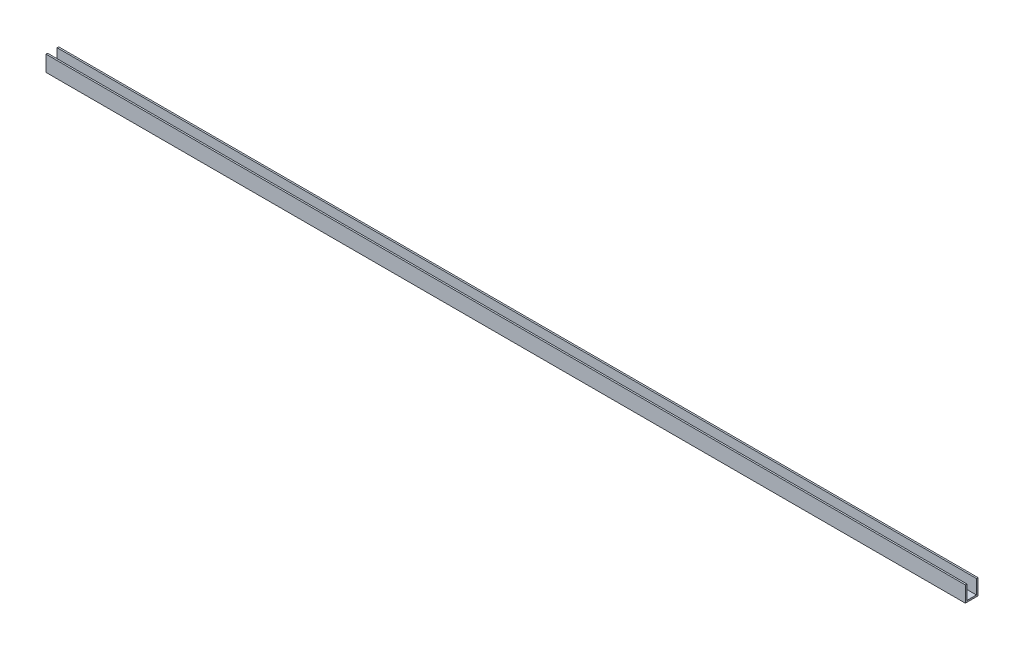
ISO-10303-21;
HEADER;
FILE_DESCRIPTION(('STEP AP214'),'2;1');
FILE_NAME('part.step','',(''),(''),'','','');
FILE_SCHEMA(('AUTOMOTIVE_DESIGN { 1 0 10303 214 1 1 1 1 }'));
ENDSEC;
DATA;
#1=APPLICATION_CONTEXT('core data for automotive mechanical design processes');
#2=APPLICATION_PROTOCOL_DEFINITION('international standard','automotive_design',2000,#1);
#3=PRODUCT_CONTEXT('',#1,'mechanical');
#4=PRODUCT('Part','Part','',(#3));
#5=PRODUCT_RELATED_PRODUCT_CATEGORY('part','',(#4));
#6=PRODUCT_DEFINITION_FORMATION('','',#4);
#7=PRODUCT_DEFINITION_CONTEXT('part definition',#1,'design');
#8=PRODUCT_DEFINITION('design','',#6,#7);
#9=PRODUCT_DEFINITION_SHAPE('','',#8);
#10=(LENGTH_UNIT() NAMED_UNIT(*) SI_UNIT(.MILLI.,.METRE.));
#11=(NAMED_UNIT(*) PLANE_ANGLE_UNIT() SI_UNIT($,.RADIAN.));
#12=(NAMED_UNIT(*) SI_UNIT($,.STERADIAN.) SOLID_ANGLE_UNIT());
#13=UNCERTAINTY_MEASURE_WITH_UNIT(LENGTH_MEASURE(1.E-05),#10,'distance_accuracy_value','');
#14=(GEOMETRIC_REPRESENTATION_CONTEXT(3) GLOBAL_UNCERTAINTY_ASSIGNED_CONTEXT((#13)) GLOBAL_UNIT_ASSIGNED_CONTEXT((#10,
#11,#12)) REPRESENTATION_CONTEXT('',''));
#15=CARTESIAN_POINT('',(0.,0.,0.));
#16=DIRECTION('',(0.,0.,1.));
#17=DIRECTION('',(1.,0.,0.));
#18=AXIS2_PLACEMENT_3D('',#15,#16,#17);
#19=CARTESIAN_POINT('',(580.,10.,4.));
#20=DIRECTION('',(0.,0.,-1.));
#21=DIRECTION('',(0.,1.,0.));
#22=AXIS2_PLACEMENT_3D('',#19,#20,#21);
#23=PLANE('',#22);
#24=DIRECTION('',(0.,-1.,0.));
#25=VECTOR('',#24,1.);
#26=CARTESIAN_POINT('',(0.,10.,4.));
#27=LINE('',#26,#25);
#28=CARTESIAN_POINT('',(0.,10.,4.));
#29=VERTEX_POINT('',#28);
#30=CARTESIAN_POINT('',(0.,0.,4.));
#31=VERTEX_POINT('',#30);
#32=EDGE_CURVE('E128',#29,#31,#27,.T.);
#33=ORIENTED_EDGE('',*,*,#32,.T.);
#34=DIRECTION('',(-1.,0.,0.));
#35=VECTOR('',#34,1.);
#36=CARTESIAN_POINT('',(580.,0.,4.));
#37=LINE('',#36,#35);
#38=CARTESIAN_POINT('',(580.,0.,4.));
#39=VERTEX_POINT('',#38);
#40=EDGE_CURVE('E11',#39,#31,#37,.T.);
#41=ORIENTED_EDGE('',*,*,#40,.F.);
#42=DIRECTION('',(0.,-1.,0.));
#43=VECTOR('',#42,1.);
#44=CARTESIAN_POINT('',(580.,10.,4.));
#45=LINE('',#44,#43);
#46=CARTESIAN_POINT('',(580.,10.,4.));
#47=VERTEX_POINT('',#46);
#48=EDGE_CURVE('E142',#47,#39,#45,.T.);
#49=ORIENTED_EDGE('',*,*,#48,.F.);
#50=DIRECTION('',(-1.,0.,0.));
#51=VECTOR('',#50,1.);
#52=CARTESIAN_POINT('',(580.,10.,4.));
#53=LINE('',#52,#51);
#54=EDGE_CURVE('E124',#47,#29,#53,.T.);
#55=ORIENTED_EDGE('',*,*,#54,.T.);
#56=EDGE_LOOP('',(#33,#41,#49,#55));
#57=FACE_BOUND('',#56,.T.);
#58=ADVANCED_FACE('F32',(#57),#23,.F.);
#59=CARTESIAN_POINT('',(580.,0.,4.));
#60=DIRECTION('',(0.,1.,0.));
#61=DIRECTION('',(0.,0.,1.));
#62=AXIS2_PLACEMENT_3D('',#59,#60,#61);
#63=PLANE('',#62);
#64=DIRECTION('',(0.,0.,-1.));
#65=VECTOR('',#64,1.);
#66=CARTESIAN_POINT('',(0.,0.,4.));
#67=LINE('',#66,#65);
#68=CARTESIAN_POINT('',(0.,0.,-4.));
#69=VERTEX_POINT('',#68);
#70=EDGE_CURVE('E131',#31,#69,#67,.T.);
#71=ORIENTED_EDGE('',*,*,#70,.T.);
#72=DIRECTION('',(-1.,0.,0.));
#73=VECTOR('',#72,1.);
#74=CARTESIAN_POINT('',(580.,0.,-4.));
#75=LINE('',#74,#73);
#76=CARTESIAN_POINT('',(580.,0.,-4.));
#77=VERTEX_POINT('',#76);
#78=EDGE_CURVE('E40',#77,#69,#75,.T.);
#79=ORIENTED_EDGE('',*,*,#78,.F.);
#80=DIRECTION('',(0.,0.,-1.));
#81=VECTOR('',#80,1.);
#82=CARTESIAN_POINT('',(580.,0.,4.));
#83=LINE('',#82,#81);
#84=EDGE_CURVE('E91',#39,#77,#83,.T.);
#85=ORIENTED_EDGE('',*,*,#84,.F.);
#86=ORIENTED_EDGE('',*,*,#40,.T.);
#87=EDGE_LOOP('',(#71,#79,#85,#86));
#88=FACE_BOUND('',#87,.T.);
#89=ADVANCED_FACE('F177',(#88),#63,.F.);
#90=CARTESIAN_POINT('',(580.,0.,-4.));
#91=DIRECTION('',(0.,0.,1.));
#92=DIRECTION('',(0.,-1.,0.));
#93=AXIS2_PLACEMENT_3D('',#90,#91,#92);
#94=PLANE('',#93);
#95=DIRECTION('',(0.,1.,0.));
#96=VECTOR('',#95,1.);
#97=CARTESIAN_POINT('',(0.,0.,-4.));
#98=LINE('',#97,#96);
#99=CARTESIAN_POINT('',(0.,10.,-4.));
#100=VERTEX_POINT('',#99);
#101=EDGE_CURVE('E133',#69,#100,#98,.T.);
#102=ORIENTED_EDGE('',*,*,#101,.T.);
#103=DIRECTION('',(-1.,0.,0.));
#104=VECTOR('',#103,1.);
#105=CARTESIAN_POINT('',(580.,10.,-4.));
#106=LINE('',#105,#104);
#107=CARTESIAN_POINT('',(580.,10.,-4.));
#108=VERTEX_POINT('',#107);
#109=EDGE_CURVE('E149',#108,#100,#106,.T.);
#110=ORIENTED_EDGE('',*,*,#109,.F.);
#111=DIRECTION('',(0.,1.,0.));
#112=VECTOR('',#111,1.);
#113=CARTESIAN_POINT('',(580.,0.,-4.));
#114=LINE('',#113,#112);
#115=EDGE_CURVE('E157',#77,#108,#114,.T.);
#116=ORIENTED_EDGE('',*,*,#115,.F.);
#117=ORIENTED_EDGE('',*,*,#78,.T.);
#118=EDGE_LOOP('',(#102,#110,#116,#117));
#119=FACE_BOUND('',#118,.T.);
#120=ADVANCED_FACE('F155',(#119),#94,.F.);
#121=CARTESIAN_POINT('',(580.,10.,-4.));
#122=DIRECTION('',(0.,-1.,0.));
#123=DIRECTION('',(0.,0.,-1.));
#124=AXIS2_PLACEMENT_3D('',#121,#122,#123);
#125=PLANE('',#124);
#126=DIRECTION('',(0.,0.,1.));
#127=VECTOR('',#126,1.);
#128=CARTESIAN_POINT('',(0.,10.,-4.));
#129=LINE('',#128,#127);
#130=CARTESIAN_POINT('',(0.,10.,-3.));
#131=VERTEX_POINT('',#130);
#132=EDGE_CURVE('E135',#100,#131,#129,.T.);
#133=ORIENTED_EDGE('',*,*,#132,.T.);
#134=DIRECTION('',(-1.,0.,0.));
#135=VECTOR('',#134,1.);
#136=CARTESIAN_POINT('',(580.,10.,-3.));
#137=LINE('',#136,#135);
#138=CARTESIAN_POINT('',(580.,10.,-3.));
#139=VERTEX_POINT('',#138);
#140=EDGE_CURVE('E146',#139,#131,#137,.T.);
#141=ORIENTED_EDGE('',*,*,#140,.F.);
#142=DIRECTION('',(0.,0.,1.));
#143=VECTOR('',#142,1.);
#144=CARTESIAN_POINT('',(580.,10.,-4.));
#145=LINE('',#144,#143);
#146=EDGE_CURVE('E169',#108,#139,#145,.T.);
#147=ORIENTED_EDGE('',*,*,#146,.F.);
#148=ORIENTED_EDGE('',*,*,#109,.T.);
#149=EDGE_LOOP('',(#133,#141,#147,#148));
#150=FACE_BOUND('',#149,.T.);
#151=ADVANCED_FACE('F165',(#150),#125,.F.);
#152=CARTESIAN_POINT('',(580.,10.,-3.));
#153=DIRECTION('',(0.,0.,-1.));
#154=DIRECTION('',(0.,1.,0.));
#155=AXIS2_PLACEMENT_3D('',#152,#153,#154);
#156=PLANE('',#155);
#157=DIRECTION('',(0.,-1.,0.));
#158=VECTOR('',#157,1.);
#159=CARTESIAN_POINT('',(0.,10.,-3.));
#160=LINE('',#159,#158);
#161=CARTESIAN_POINT('',(0.,1.,-3.));
#162=VERTEX_POINT('',#161);
#163=EDGE_CURVE('E137',#131,#162,#160,.T.);
#164=ORIENTED_EDGE('',*,*,#163,.T.);
#165=DIRECTION('',(-1.,0.,0.));
#166=VECTOR('',#165,1.);
#167=CARTESIAN_POINT('',(580.,1.,-3.));
#168=LINE('',#167,#166);
#169=CARTESIAN_POINT('',(580.,1.,-3.));
#170=VERTEX_POINT('',#169);
#171=EDGE_CURVE('E119',#170,#162,#168,.T.);
#172=ORIENTED_EDGE('',*,*,#171,.F.);
#173=DIRECTION('',(0.,-1.,0.));
#174=VECTOR('',#173,1.);
#175=CARTESIAN_POINT('',(580.,10.,-3.));
#176=LINE('',#175,#174);
#177=EDGE_CURVE('E110',#139,#170,#176,.T.);
#178=ORIENTED_EDGE('',*,*,#177,.F.);
#179=ORIENTED_EDGE('',*,*,#140,.T.);
#180=EDGE_LOOP('',(#164,#172,#178,#179));
#181=FACE_BOUND('',#180,.T.);
#182=ADVANCED_FACE('F168',(#181),#156,.F.);
#183=CARTESIAN_POINT('',(580.,1.,-3.));
#184=DIRECTION('',(0.,-1.,0.));
#185=DIRECTION('',(0.,0.,-1.));
#186=AXIS2_PLACEMENT_3D('',#183,#184,#185);
#187=PLANE('',#186);
#188=DIRECTION('',(0.,0.,1.));
#189=VECTOR('',#188,1.);
#190=CARTESIAN_POINT('',(0.,1.,-3.));
#191=LINE('',#190,#189);
#192=CARTESIAN_POINT('',(0.,1.,3.));
#193=VERTEX_POINT('',#192);
#194=EDGE_CURVE('E118',#162,#193,#191,.T.);
#195=ORIENTED_EDGE('',*,*,#194,.T.);
#196=DIRECTION('',(-1.,0.,0.));
#197=VECTOR('',#196,1.);
#198=CARTESIAN_POINT('',(580.,1.,3.));
#199=LINE('',#198,#197);
#200=CARTESIAN_POINT('',(580.,1.,3.));
#201=VERTEX_POINT('',#200);
#202=EDGE_CURVE('E115',#201,#193,#199,.T.);
#203=ORIENTED_EDGE('',*,*,#202,.F.);
#204=DIRECTION('',(0.,0.,1.));
#205=VECTOR('',#204,1.);
#206=CARTESIAN_POINT('',(580.,1.,-3.));
#207=LINE('',#206,#205);
#208=EDGE_CURVE('E104',#170,#201,#207,.T.);
#209=ORIENTED_EDGE('',*,*,#208,.F.);
#210=ORIENTED_EDGE('',*,*,#171,.T.);
#211=EDGE_LOOP('',(#195,#203,#209,#210));
#212=FACE_BOUND('',#211,.T.);
#213=ADVANCED_FACE('F116',(#212),#187,.F.);
#214=CARTESIAN_POINT('',(580.,1.,3.));
#215=DIRECTION('',(0.,0.,1.));
#216=DIRECTION('',(1.,0.,0.));
#217=AXIS2_PLACEMENT_3D('',#214,#215,#216);
#218=PLANE('',#217);
#219=DIRECTION('',(0.,1.,0.));
#220=VECTOR('',#219,1.);
#221=CARTESIAN_POINT('',(0.,1.,3.));
#222=LINE('',#221,#220);
#223=CARTESIAN_POINT('',(0.,10.,3.));
#224=VERTEX_POINT('',#223);
#225=EDGE_CURVE('E77',#193,#224,#222,.T.);
#226=ORIENTED_EDGE('',*,*,#225,.T.);
#227=DIRECTION('',(-1.,0.,0.));
#228=VECTOR('',#227,1.);
#229=CARTESIAN_POINT('',(580.,10.,3.));
#230=LINE('',#229,#228);
#231=CARTESIAN_POINT('',(580.,10.,3.));
#232=VERTEX_POINT('',#231);
#233=EDGE_CURVE('E120',#232,#224,#230,.T.);
#234=ORIENTED_EDGE('',*,*,#233,.F.);
#235=DIRECTION('',(0.,1.,0.));
#236=VECTOR('',#235,1.);
#237=CARTESIAN_POINT('',(580.,1.,3.));
#238=LINE('',#237,#236);
#239=EDGE_CURVE('E108',#201,#232,#238,.T.);
#240=ORIENTED_EDGE('',*,*,#239,.F.);
#241=ORIENTED_EDGE('',*,*,#202,.T.);
#242=EDGE_LOOP('',(#226,#234,#240,#241));
#243=FACE_BOUND('',#242,.T.);
#244=ADVANCED_FACE('F122',(#243),#218,.F.);
#245=CARTESIAN_POINT('',(580.,10.,3.));
#246=DIRECTION('',(0.,-1.,0.));
#247=DIRECTION('',(0.,0.,-1.));
#248=AXIS2_PLACEMENT_3D('',#245,#246,#247);
#249=PLANE('',#248);
#250=DIRECTION('',(0.,0.,1.));
#251=VECTOR('',#250,1.);
#252=CARTESIAN_POINT('',(0.,10.,3.));
#253=LINE('',#252,#251);
#254=EDGE_CURVE('E83',#224,#29,#253,.T.);
#255=ORIENTED_EDGE('',*,*,#254,.T.);
#256=ORIENTED_EDGE('',*,*,#54,.F.);
#257=DIRECTION('',(0.,0.,1.));
#258=VECTOR('',#257,1.);
#259=CARTESIAN_POINT('',(580.,10.,3.));
#260=LINE('',#259,#258);
#261=EDGE_CURVE('E48',#232,#47,#260,.T.);
#262=ORIENTED_EDGE('',*,*,#261,.F.);
#263=ORIENTED_EDGE('',*,*,#233,.T.);
#264=EDGE_LOOP('',(#255,#256,#262,#263));
#265=FACE_BOUND('',#264,.T.);
#266=ADVANCED_FACE('F193',(#265),#249,.F.);
#267=CARTESIAN_POINT('',(580.,0.,0.));
#268=DIRECTION('',(1.,0.,0.));
#269=DIRECTION('',(0.,0.,-1.));
#270=AXIS2_PLACEMENT_3D('',#267,#268,#269);
#271=PLANE('',#270);
#272=ORIENTED_EDGE('',*,*,#48,.T.);
#273=ORIENTED_EDGE('',*,*,#84,.T.);
#274=ORIENTED_EDGE('',*,*,#115,.T.);
#275=ORIENTED_EDGE('',*,*,#146,.T.);
#276=ORIENTED_EDGE('',*,*,#177,.T.);
#277=ORIENTED_EDGE('',*,*,#208,.T.);
#278=ORIENTED_EDGE('',*,*,#239,.T.);
#279=ORIENTED_EDGE('',*,*,#261,.T.);
#280=EDGE_LOOP('',(#272,#273,#274,#275,#276,#277,#278,#279));
#281=FACE_BOUND('',#280,.T.);
#282=ADVANCED_FACE('F106',(#281),#271,.T.);
#283=CARTESIAN_POINT('',(0.,0.,0.));
#284=DIRECTION('',(1.,0.,0.));
#285=DIRECTION('',(0.,0.,-1.));
#286=AXIS2_PLACEMENT_3D('',#283,#284,#285);
#287=PLANE('',#286);
#288=ORIENTED_EDGE('',*,*,#32,.F.);
#289=ORIENTED_EDGE('',*,*,#254,.F.);
#290=ORIENTED_EDGE('',*,*,#225,.F.);
#291=ORIENTED_EDGE('',*,*,#194,.F.);
#292=ORIENTED_EDGE('',*,*,#163,.F.);
#293=ORIENTED_EDGE('',*,*,#132,.F.);
#294=ORIENTED_EDGE('',*,*,#101,.F.);
#295=ORIENTED_EDGE('',*,*,#70,.F.);
#296=EDGE_LOOP('',(#288,#289,#290,#291,#292,#293,#294,#295));
#297=FACE_BOUND('',#296,.T.);
#298=ADVANCED_FACE('F161',(#297),#287,.F.);
#299=CLOSED_SHELL('',(#58,#89,#120,#151,#182,#213,#244,#266,#282,#298));
#300=MANIFOLD_SOLID_BREP('B2',#299);
#301=ADVANCED_BREP_SHAPE_REPRESENTATION('',(#18,#300),#14);
#302=SHAPE_DEFINITION_REPRESENTATION(#9,#301);
ENDSEC;
END-ISO-10303-21;
